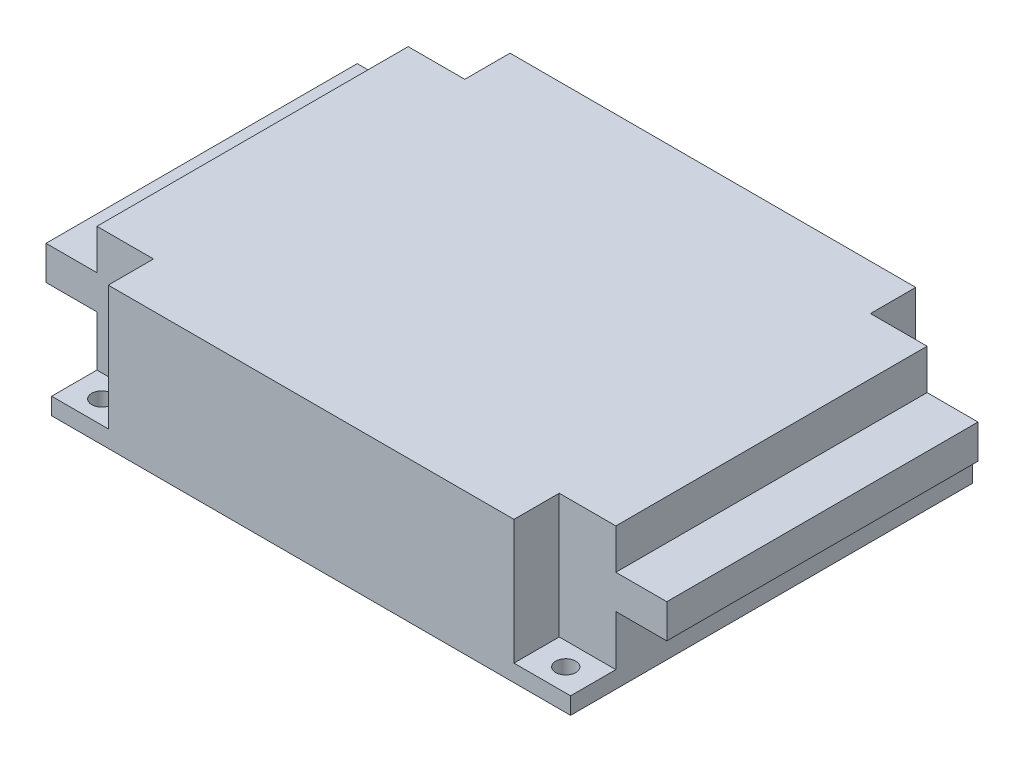
ISO-10303-21;
HEADER;
FILE_DESCRIPTION(('STEP AP214'),'2;1');
FILE_NAME('part.step','',(''),(''),'','','');
FILE_SCHEMA(('AUTOMOTIVE_DESIGN { 1 0 10303 214 1 1 1 1 }'));
ENDSEC;
DATA;
#1=APPLICATION_CONTEXT('core data for automotive mechanical design processes');
#2=APPLICATION_PROTOCOL_DEFINITION('international standard','automotive_design',2000,#1);
#3=PRODUCT_CONTEXT('',#1,'mechanical');
#4=PRODUCT('Part','Part','',(#3));
#5=PRODUCT_RELATED_PRODUCT_CATEGORY('part','',(#4));
#6=PRODUCT_DEFINITION_FORMATION('','',#4);
#7=PRODUCT_DEFINITION_CONTEXT('part definition',#1,'design');
#8=PRODUCT_DEFINITION('design','',#6,#7);
#9=PRODUCT_DEFINITION_SHAPE('','',#8);
#10=(LENGTH_UNIT() NAMED_UNIT(*) SI_UNIT(.MILLI.,.METRE.));
#11=(NAMED_UNIT(*) PLANE_ANGLE_UNIT() SI_UNIT($,.RADIAN.));
#12=(NAMED_UNIT(*) SI_UNIT($,.STERADIAN.) SOLID_ANGLE_UNIT());
#13=UNCERTAINTY_MEASURE_WITH_UNIT(LENGTH_MEASURE(1.E-05),#10,'distance_accuracy_value','');
#14=(GEOMETRIC_REPRESENTATION_CONTEXT(3) GLOBAL_UNCERTAINTY_ASSIGNED_CONTEXT((#13)) GLOBAL_UNIT_ASSIGNED_CONTEXT((#10,
#11,#12)) REPRESENTATION_CONTEXT('',''));
#15=CARTESIAN_POINT('',(0.,0.,0.));
#16=DIRECTION('',(0.,0.,1.));
#17=DIRECTION('',(1.,0.,0.));
#18=AXIS2_PLACEMENT_3D('',#15,#16,#17);
#19=CARTESIAN_POINT('',(91.7,3.,0.));
#20=DIRECTION('',(1.,0.,0.));
#21=DIRECTION('',(0.,0.,-1.));
#22=AXIS2_PLACEMENT_3D('',#19,#20,#21);
#23=PLANE('',#22);
#24=DIRECTION('',(0.,0.,-1.));
#25=VECTOR('',#24,1.);
#26=CARTESIAN_POINT('',(91.7,11.9,-51.9997296170942));
#27=LINE('',#26,#25);
#28=CARTESIAN_POINT('',(91.7,11.9,2.99972961709421));
#29=VERTEX_POINT('',#28);
#30=CARTESIAN_POINT('',(91.7,11.9,-51.9997296170942));
#31=VERTEX_POINT('',#30);
#32=EDGE_CURVE('E51',#29,#31,#27,.T.);
#33=ORIENTED_EDGE('',*,*,#32,.F.);
#34=DIRECTION('',(0.,-1.,0.));
#35=VECTOR('',#34,1.);
#36=CARTESIAN_POINT('',(91.7,25.,2.99972961709421));
#37=LINE('',#36,#35);
#38=CARTESIAN_POINT('',(91.7,3.,2.99972961709421));
#39=VERTEX_POINT('',#38);
#40=EDGE_CURVE('E337',#29,#39,#37,.T.);
#41=ORIENTED_EDGE('',*,*,#40,.T.);
#42=DIRECTION('',(0.,0.,-1.));
#43=VECTOR('',#42,1.);
#44=CARTESIAN_POINT('',(91.7,3.,0.));
#45=LINE('',#44,#43);
#46=CARTESIAN_POINT('',(91.7,3.,11.));
#47=VERTEX_POINT('',#46);
#48=EDGE_CURVE('E297',#47,#39,#45,.T.);
#49=ORIENTED_EDGE('',*,*,#48,.F.);
#50=DIRECTION('',(0.,-1.,0.));
#51=VECTOR('',#50,1.);
#52=CARTESIAN_POINT('',(91.7,3.,11.));
#53=LINE('',#52,#51);
#54=CARTESIAN_POINT('',(91.7,0.,11.));
#55=VERTEX_POINT('',#54);
#56=EDGE_CURVE('E300',#47,#55,#53,.T.);
#57=ORIENTED_EDGE('',*,*,#56,.T.);
#58=DIRECTION('',(0.,0.,1.));
#59=VECTOR('',#58,1.);
#60=CARTESIAN_POINT('',(91.7,0.,0.));
#61=LINE('',#60,#59);
#62=CARTESIAN_POINT('',(91.7,0.,-60.));
#63=VERTEX_POINT('',#62);
#64=EDGE_CURVE('E376',#63,#55,#61,.T.);
#65=ORIENTED_EDGE('',*,*,#64,.F.);
#66=DIRECTION('',(0.,-1.,0.));
#67=VECTOR('',#66,1.);
#68=CARTESIAN_POINT('',(91.7,3.,-60.));
#69=LINE('',#68,#67);
#70=CARTESIAN_POINT('',(91.7,3.,-60.));
#71=VERTEX_POINT('',#70);
#72=EDGE_CURVE('E11',#71,#63,#69,.T.);
#73=ORIENTED_EDGE('',*,*,#72,.F.);
#74=DIRECTION('',(0.,0.,1.));
#75=VECTOR('',#74,1.);
#76=CARTESIAN_POINT('',(91.7,3.,0.));
#77=LINE('',#76,#75);
#78=CARTESIAN_POINT('',(91.7,3.,-51.9997296170942));
#79=VERTEX_POINT('',#78);
#80=EDGE_CURVE('E382',#71,#79,#77,.T.);
#81=ORIENTED_EDGE('',*,*,#80,.T.);
#82=DIRECTION('',(0.,-1.,0.));
#83=VECTOR('',#82,1.);
#84=CARTESIAN_POINT('',(91.7,25.,-51.9997296170942));
#85=LINE('',#84,#83);
#86=EDGE_CURVE('E56',#31,#79,#85,.T.);
#87=ORIENTED_EDGE('',*,*,#86,.F.);
#88=EDGE_LOOP('',(#33,#41,#49,#57,#65,#73,#81,#87));
#89=FACE_BOUND('',#88,.T.);
#90=ADVANCED_FACE('F36',(#89),#23,.T.);
#91=CARTESIAN_POINT('',(0.,25.,0.));
#92=DIRECTION('',(1.,0.,0.));
#93=DIRECTION('',(0.,0.,-1.));
#94=AXIS2_PLACEMENT_3D('',#91,#92,#93);
#95=PLANE('',#94);
#96=DIRECTION('',(0.,-1.,0.));
#97=VECTOR('',#96,1.);
#98=CARTESIAN_POINT('',(0.,25.,2.99972961709421));
#99=LINE('',#98,#97);
#100=CARTESIAN_POINT('',(0.,11.9,2.99972961709421));
#101=VERTEX_POINT('',#100);
#102=CARTESIAN_POINT('',(0.,3.,2.99972961709421));
#103=VERTEX_POINT('',#102);
#104=EDGE_CURVE('E354',#101,#103,#99,.T.);
#105=ORIENTED_EDGE('',*,*,#104,.F.);
#106=DIRECTION('',(0.,0.,-1.));
#107=VECTOR('',#106,1.);
#108=CARTESIAN_POINT('',(0.,11.9,2.99972961709421));
#109=LINE('',#108,#107);
#110=CARTESIAN_POINT('',(0.,11.9,-51.9997296170942));
#111=VERTEX_POINT('',#110);
#112=EDGE_CURVE('E217',#101,#111,#109,.T.);
#113=ORIENTED_EDGE('',*,*,#112,.T.);
#114=DIRECTION('',(0.,-1.,0.));
#115=VECTOR('',#114,1.);
#116=CARTESIAN_POINT('',(0.,25.,-51.9997296170942));
#117=LINE('',#116,#115);
#118=CARTESIAN_POINT('',(0.,3.,-51.9997296170942));
#119=VERTEX_POINT('',#118);
#120=EDGE_CURVE('E358',#111,#119,#117,.T.);
#121=ORIENTED_EDGE('',*,*,#120,.T.);
#122=DIRECTION('',(0.,0.,1.));
#123=VECTOR('',#122,1.);
#124=CARTESIAN_POINT('',(0.,3.,0.));
#125=LINE('',#124,#123);
#126=CARTESIAN_POINT('',(0.,3.,-60.));
#127=VERTEX_POINT('',#126);
#128=EDGE_CURVE('E255',#127,#119,#125,.T.);
#129=ORIENTED_EDGE('',*,*,#128,.F.);
#130=DIRECTION('',(0.,-1.,0.));
#131=VECTOR('',#130,1.);
#132=CARTESIAN_POINT('',(0.,3.,-60.));
#133=LINE('',#132,#131);
#134=CARTESIAN_POINT('',(0.,0.,-60.));
#135=VERTEX_POINT('',#134);
#136=EDGE_CURVE('E262',#127,#135,#133,.T.);
#137=ORIENTED_EDGE('',*,*,#136,.T.);
#138=DIRECTION('',(0.,0.,1.));
#139=VECTOR('',#138,1.);
#140=CARTESIAN_POINT('',(0.,0.,0.));
#141=LINE('',#140,#139);
#142=CARTESIAN_POINT('',(0.,0.,11.));
#143=VERTEX_POINT('',#142);
#144=EDGE_CURVE('E305',#135,#143,#141,.T.);
#145=ORIENTED_EDGE('',*,*,#144,.T.);
#146=DIRECTION('',(0.,-1.,0.));
#147=VECTOR('',#146,1.);
#148=CARTESIAN_POINT('',(0.,3.,11.));
#149=LINE('',#148,#147);
#150=CARTESIAN_POINT('',(0.,3.,11.));
#151=VERTEX_POINT('',#150);
#152=EDGE_CURVE('E282',#151,#143,#149,.T.);
#153=ORIENTED_EDGE('',*,*,#152,.F.);
#154=DIRECTION('',(0.,0.,-1.));
#155=VECTOR('',#154,1.);
#156=CARTESIAN_POINT('',(0.,3.,0.));
#157=LINE('',#156,#155);
#158=EDGE_CURVE('E271',#151,#103,#157,.T.);
#159=ORIENTED_EDGE('',*,*,#158,.T.);
#160=EDGE_LOOP('',(#105,#113,#121,#129,#137,#145,#153,#159));
#161=FACE_BOUND('',#160,.T.);
#162=ADVANCED_FACE('F427',(#161),#95,.F.);
#163=DIRECTION('',(0.,0.,1.));
#164=VECTOR('',#163,1.);
#165=CARTESIAN_POINT('',(91.7,17.9,2.99972961709421));
#166=LINE('',#165,#164);
#167=CARTESIAN_POINT('',(91.7,17.9,-51.9997296170942));
#168=VERTEX_POINT('',#167);
#169=CARTESIAN_POINT('',(91.7,17.9,2.99972961709421));
#170=VERTEX_POINT('',#169);
#171=EDGE_CURVE('E214',#168,#170,#166,.T.);
#172=ORIENTED_EDGE('',*,*,#171,.F.);
#173=CARTESIAN_POINT('',(91.7,25.,-51.9997296170942));
#174=VERTEX_POINT('',#173);
#175=EDGE_CURVE('E374',#174,#168,#85,.T.);
#176=ORIENTED_EDGE('',*,*,#175,.F.);
#177=DIRECTION('',(0.,0.,1.));
#178=VECTOR('',#177,1.);
#179=CARTESIAN_POINT('',(91.7,25.,0.));
#180=LINE('',#179,#178);
#181=CARTESIAN_POINT('',(91.7,25.,2.99972961709421));
#182=VERTEX_POINT('',#181);
#183=EDGE_CURVE('E306',#174,#182,#180,.T.);
#184=ORIENTED_EDGE('',*,*,#183,.T.);
#185=EDGE_CURVE('E340',#182,#170,#37,.T.);
#186=ORIENTED_EDGE('',*,*,#185,.T.);
#187=EDGE_LOOP('',(#172,#176,#184,#186));
#188=FACE_BOUND('',#187,.T.);
#189=ADVANCED_FACE('F38',(#188),#23,.T.);
#190=CARTESIAN_POINT('',(0.,3.,-60.));
#191=DIRECTION('',(0.,0.,-1.));
#192=DIRECTION('',(-1.,0.,0.));
#193=AXIS2_PLACEMENT_3D('',#190,#191,#192);
#194=PLANE('',#193);
#195=DIRECTION('',(1.,0.,0.));
#196=VECTOR('',#195,1.);
#197=CARTESIAN_POINT('',(0.,0.,-60.));
#198=LINE('',#197,#196);
#199=EDGE_CURVE('E391',#135,#63,#198,.T.);
#200=ORIENTED_EDGE('',*,*,#199,.F.);
#201=ORIENTED_EDGE('',*,*,#136,.F.);
#202=DIRECTION('',(1.,0.,0.));
#203=VECTOR('',#202,1.);
#204=CARTESIAN_POINT('',(0.,3.,-60.));
#205=LINE('',#204,#203);
#206=CARTESIAN_POINT('',(10.0029233499299,3.,-60.));
#207=VERTEX_POINT('',#206);
#208=EDGE_CURVE('E252',#127,#207,#205,.T.);
#209=ORIENTED_EDGE('',*,*,#208,.T.);
#210=DIRECTION('',(0.,-1.,0.));
#211=VECTOR('',#210,1.);
#212=CARTESIAN_POINT('',(10.0029233499299,25.,-60.));
#213=LINE('',#212,#211);
#214=CARTESIAN_POINT('',(10.0029233499299,25.,-60.));
#215=VERTEX_POINT('',#214);
#216=EDGE_CURVE('E365',#215,#207,#213,.T.);
#217=ORIENTED_EDGE('',*,*,#216,.F.);
#218=DIRECTION('',(1.,0.,0.));
#219=VECTOR('',#218,1.);
#220=CARTESIAN_POINT('',(0.,25.,-60.));
#221=LINE('',#220,#219);
#222=CARTESIAN_POINT('',(81.6970766500701,25.,-60.));
#223=VERTEX_POINT('',#222);
#224=EDGE_CURVE('E314',#215,#223,#221,.T.);
#225=ORIENTED_EDGE('',*,*,#224,.T.);
#226=DIRECTION('',(0.,-1.,0.));
#227=VECTOR('',#226,1.);
#228=CARTESIAN_POINT('',(81.6970766500701,25.,-60.));
#229=LINE('',#228,#227);
#230=CARTESIAN_POINT('',(81.6970766500701,3.,-60.));
#231=VERTEX_POINT('',#230);
#232=EDGE_CURVE('E368',#223,#231,#229,.T.);
#233=ORIENTED_EDGE('',*,*,#232,.T.);
#234=DIRECTION('',(1.,0.,0.));
#235=VECTOR('',#234,1.);
#236=CARTESIAN_POINT('',(0.,3.,-60.));
#237=LINE('',#236,#235);
#238=EDGE_CURVE('E384',#231,#71,#237,.T.);
#239=ORIENTED_EDGE('',*,*,#238,.T.);
#240=ORIENTED_EDGE('',*,*,#72,.T.);
#241=EDGE_LOOP('',(#200,#201,#209,#217,#225,#233,#239,#240));
#242=FACE_BOUND('',#241,.T.);
#243=ADVANCED_FACE('F435',(#242),#194,.T.);
#244=CARTESIAN_POINT('',(86.8463240658172,3.,-55.9996014014068));
#245=DIRECTION('',(0.,-1.,0.));
#246=DIRECTION('',(0.,0.,-1.));
#247=AXIS2_PLACEMENT_3D('',#244,#245,#246);
#248=CYLINDRICAL_SURFACE('',#247,1.76559838278759);
#249=CARTESIAN_POINT('',(86.8463240658172,3.,-55.9996014014068));
#250=DIRECTION('',(0.,1.,0.));
#251=DIRECTION('',(0.,0.,1.));
#252=AXIS2_PLACEMENT_3D('',#249,#250,#251);
#253=CIRCLE('',#252,1.76559838278759);
#254=CARTESIAN_POINT('',(86.8463240658172,3.,-54.2340030186192));
#255=VERTEX_POINT('',#254);
#256=EDGE_CURVE('E44',#255,#255,#253,.F.);
#257=ORIENTED_EDGE('',*,*,#256,.F.);
#258=EDGE_LOOP('',(#257));
#259=FACE_BOUND('',#258,.T.);
#260=CARTESIAN_POINT('',(86.8463240658172,0.,-55.9996014014068));
#261=DIRECTION('',(0.,1.,0.));
#262=DIRECTION('',(0.,0.,1.));
#263=AXIS2_PLACEMENT_3D('',#260,#261,#262);
#264=CIRCLE('',#263,1.76559838278759);
#265=CARTESIAN_POINT('',(86.8463240658172,0.,-54.2340030186192));
#266=VERTEX_POINT('',#265);
#267=EDGE_CURVE('E380',#266,#266,#264,.F.);
#268=ORIENTED_EDGE('',*,*,#267,.T.);
#269=EDGE_LOOP('',(#268));
#270=FACE_BOUND('',#269,.T.);
#271=ADVANCED_FACE('F396',(#259,#270),#248,.F.);
#272=CARTESIAN_POINT('',(0.,3.,0.));
#273=DIRECTION('',(0.,1.,0.));
#274=DIRECTION('',(0.,0.,1.));
#275=AXIS2_PLACEMENT_3D('',#272,#273,#274);
#276=PLANE('',#275);
#277=DIRECTION('',(0.,0.,-1.));
#278=VECTOR('',#277,1.);
#279=CARTESIAN_POINT('',(81.6970766500701,3.,0.));
#280=LINE('',#279,#278);
#281=CARTESIAN_POINT('',(81.6970766500701,3.,-51.9997296170942));
#282=VERTEX_POINT('',#281);
#283=EDGE_CURVE('E377',#282,#231,#280,.T.);
#284=ORIENTED_EDGE('',*,*,#283,.F.);
#285=DIRECTION('',(-1.,0.,0.));
#286=VECTOR('',#285,1.);
#287=CARTESIAN_POINT('',(0.,3.,-51.9997296170942));
#288=LINE('',#287,#286);
#289=EDGE_CURVE('E379',#79,#282,#288,.T.);
#290=ORIENTED_EDGE('',*,*,#289,.F.);
#291=ORIENTED_EDGE('',*,*,#80,.F.);
#292=ORIENTED_EDGE('',*,*,#238,.F.);
#293=EDGE_LOOP('',(#284,#290,#291,#292));
#294=FACE_BOUND('',#293,.T.);
#295=ORIENTED_EDGE('',*,*,#256,.T.);
#296=EDGE_LOOP('',(#295));
#297=FACE_BOUND('',#296,.T.);
#298=ADVANCED_FACE('F401',(#294,#297),#276,.T.);
#299=CARTESIAN_POINT('',(0.,0.,0.));
#300=DIRECTION('',(0.,1.,0.));
#301=DIRECTION('',(0.,0.,1.));
#302=AXIS2_PLACEMENT_3D('',#299,#300,#301);
#303=PLANE('',#302);
#304=ORIENTED_EDGE('',*,*,#144,.F.);
#305=ORIENTED_EDGE('',*,*,#199,.T.);
#306=ORIENTED_EDGE('',*,*,#64,.T.);
#307=DIRECTION('',(1.,0.,0.));
#308=VECTOR('',#307,1.);
#309=CARTESIAN_POINT('',(0.,0.,11.));
#310=LINE('',#309,#308);
#311=EDGE_CURVE('E310',#143,#55,#310,.T.);
#312=ORIENTED_EDGE('',*,*,#311,.F.);
#313=EDGE_LOOP('',(#304,#305,#306,#312));
#314=FACE_BOUND('',#313,.T.);
#315=ORIENTED_EDGE('',*,*,#267,.F.);
#316=EDGE_LOOP('',(#315));
#317=FACE_BOUND('',#316,.T.);
#318=CARTESIAN_POINT('',(86.8463240658172,0.,6.99960140140685));
#319=DIRECTION('',(0.,1.,0.));
#320=DIRECTION('',(0.,0.,1.));
#321=AXIS2_PLACEMENT_3D('',#318,#319,#320);
#322=CIRCLE('',#321,1.76559838278758);
#323=CARTESIAN_POINT('',(86.8463240658172,0.,8.76519978419443));
#324=VERTEX_POINT('',#323);
#325=EDGE_CURVE('E287',#324,#324,#322,.T.);
#326=ORIENTED_EDGE('',*,*,#325,.T.);
#327=EDGE_LOOP('',(#326));
#328=FACE_BOUND('',#327,.T.);
#329=CARTESIAN_POINT('',(4.85367593418285,0.,6.99960140140685));
#330=DIRECTION('',(0.,1.,0.));
#331=DIRECTION('',(0.,0.,1.));
#332=AXIS2_PLACEMENT_3D('',#329,#330,#331);
#333=CIRCLE('',#332,1.76559838278757);
#334=CARTESIAN_POINT('',(4.85367593418285,0.,8.76519978419442));
#335=VERTEX_POINT('',#334);
#336=EDGE_CURVE('E267',#335,#335,#333,.F.);
#337=ORIENTED_EDGE('',*,*,#336,.F.);
#338=EDGE_LOOP('',(#337));
#339=FACE_BOUND('',#338,.T.);
#340=CARTESIAN_POINT('',(4.85367593418285,0.,-55.9996014014068));
#341=DIRECTION('',(0.,1.,0.));
#342=DIRECTION('',(0.,0.,1.));
#343=AXIS2_PLACEMENT_3D('',#340,#341,#342);
#344=CIRCLE('',#343,1.76559838278758);
#345=CARTESIAN_POINT('',(4.85367593418285,0.,-54.2340030186193));
#346=VERTEX_POINT('',#345);
#347=EDGE_CURVE('E243',#346,#346,#344,.T.);
#348=ORIENTED_EDGE('',*,*,#347,.T.);
#349=EDGE_LOOP('',(#348));
#350=FACE_BOUND('',#349,.T.);
#351=ADVANCED_FACE('F398',(#314,#317,#328,#339,#350),#303,.F.);
#352=CARTESIAN_POINT('',(0.,25.,-51.9997296170942));
#353=DIRECTION('',(0.,0.,1.));
#354=DIRECTION('',(1.,0.,0.));
#355=AXIS2_PLACEMENT_3D('',#352,#353,#354);
#356=PLANE('',#355);
#357=ORIENTED_EDGE('',*,*,#289,.T.);
#358=DIRECTION('',(0.,-1.,0.));
#359=VECTOR('',#358,1.);
#360=CARTESIAN_POINT('',(81.6970766500701,25.,-51.9997296170942));
#361=LINE('',#360,#359);
#362=CARTESIAN_POINT('',(81.6970766500701,25.,-51.9997296170942));
#363=VERTEX_POINT('',#362);
#364=EDGE_CURVE('E371',#363,#282,#361,.T.);
#365=ORIENTED_EDGE('',*,*,#364,.F.);
#366=DIRECTION('',(-1.,0.,0.));
#367=VECTOR('',#366,1.);
#368=CARTESIAN_POINT('',(0.,25.,-51.9997296170942));
#369=LINE('',#368,#367);
#370=EDGE_CURVE('E309',#174,#363,#369,.T.);
#371=ORIENTED_EDGE('',*,*,#370,.F.);
#372=ORIENTED_EDGE('',*,*,#175,.T.);
#373=DIRECTION('',(-1.,0.,0.));
#374=VECTOR('',#373,1.);
#375=CARTESIAN_POINT('',(100.7,17.9,-51.9997296170942));
#376=LINE('',#375,#374);
#377=CARTESIAN_POINT('',(100.7,17.9,-51.9997296170942));
#378=VERTEX_POINT('',#377);
#379=EDGE_CURVE('E201',#378,#168,#376,.T.);
#380=ORIENTED_EDGE('',*,*,#379,.F.);
#381=DIRECTION('',(0.,1.,0.));
#382=VECTOR('',#381,1.);
#383=CARTESIAN_POINT('',(100.7,17.9,-51.9997296170942));
#384=LINE('',#383,#382);
#385=CARTESIAN_POINT('',(100.7,11.9,-51.9997296170942));
#386=VERTEX_POINT('',#385);
#387=EDGE_CURVE('E194',#386,#378,#384,.T.);
#388=ORIENTED_EDGE('',*,*,#387,.F.);
#389=DIRECTION('',(-1.,0.,0.));
#390=VECTOR('',#389,1.);
#391=CARTESIAN_POINT('',(100.7,11.9,-51.9997296170942));
#392=LINE('',#391,#390);
#393=EDGE_CURVE('E198',#386,#31,#392,.T.);
#394=ORIENTED_EDGE('',*,*,#393,.T.);
#395=ORIENTED_EDGE('',*,*,#86,.T.);
#396=EDGE_LOOP('',(#357,#365,#371,#372,#380,#388,#394,#395));
#397=FACE_BOUND('',#396,.T.);
#398=ADVANCED_FACE('F196',(#397),#356,.F.);
#399=CARTESIAN_POINT('',(81.6970766500701,25.,0.));
#400=DIRECTION('',(-1.,0.,0.));
#401=DIRECTION('',(0.,0.,1.));
#402=AXIS2_PLACEMENT_3D('',#399,#400,#401);
#403=PLANE('',#402);
#404=ORIENTED_EDGE('',*,*,#283,.T.);
#405=ORIENTED_EDGE('',*,*,#232,.F.);
#406=DIRECTION('',(0.,0.,-1.));
#407=VECTOR('',#406,1.);
#408=CARTESIAN_POINT('',(81.6970766500701,25.,0.));
#409=LINE('',#408,#407);
#410=EDGE_CURVE('E312',#363,#223,#409,.T.);
#411=ORIENTED_EDGE('',*,*,#410,.F.);
#412=ORIENTED_EDGE('',*,*,#364,.T.);
#413=EDGE_LOOP('',(#404,#405,#411,#412));
#414=FACE_BOUND('',#413,.T.);
#415=ADVANCED_FACE('F480',(#414),#403,.F.);
#416=CARTESIAN_POINT('',(10.0029233499299,25.,0.));
#417=DIRECTION('',(-1.,0.,0.));
#418=DIRECTION('',(0.,0.,1.));
#419=AXIS2_PLACEMENT_3D('',#416,#417,#418);
#420=PLANE('',#419);
#421=DIRECTION('',(0.,0.,-1.));
#422=VECTOR('',#421,1.);
#423=CARTESIAN_POINT('',(10.0029233499299,3.,0.));
#424=LINE('',#423,#422);
#425=CARTESIAN_POINT('',(10.0029233499299,3.,-51.9997296170942));
#426=VERTEX_POINT('',#425);
#427=EDGE_CURVE('E260',#426,#207,#424,.T.);
#428=ORIENTED_EDGE('',*,*,#427,.F.);
#429=DIRECTION('',(0.,-1.,0.));
#430=VECTOR('',#429,1.);
#431=CARTESIAN_POINT('',(10.0029233499299,25.,-51.9997296170942));
#432=LINE('',#431,#430);
#433=CARTESIAN_POINT('',(10.0029233499299,25.,-51.9997296170942));
#434=VERTEX_POINT('',#433);
#435=EDGE_CURVE('E362',#434,#426,#432,.T.);
#436=ORIENTED_EDGE('',*,*,#435,.F.);
#437=DIRECTION('',(0.,0.,-1.));
#438=VECTOR('',#437,1.);
#439=CARTESIAN_POINT('',(10.0029233499299,25.,0.));
#440=LINE('',#439,#438);
#441=EDGE_CURVE('E317',#434,#215,#440,.T.);
#442=ORIENTED_EDGE('',*,*,#441,.T.);
#443=ORIENTED_EDGE('',*,*,#216,.T.);
#444=EDGE_LOOP('',(#428,#436,#442,#443));
#445=FACE_BOUND('',#444,.T.);
#446=ADVANCED_FACE('F510',(#445),#420,.T.);
#447=CARTESIAN_POINT('',(0.,25.,-51.9997296170942));
#448=DIRECTION('',(0.,0.,-1.));
#449=DIRECTION('',(-1.,0.,0.));
#450=AXIS2_PLACEMENT_3D('',#447,#448,#449);
#451=PLANE('',#450);
#452=DIRECTION('',(1.,0.,0.));
#453=VECTOR('',#452,1.);
#454=CARTESIAN_POINT('',(0.,3.,-51.9997296170942));
#455=LINE('',#454,#453);
#456=EDGE_CURVE('E258',#119,#426,#455,.T.);
#457=ORIENTED_EDGE('',*,*,#456,.F.);
#458=ORIENTED_EDGE('',*,*,#120,.F.);
#459=DIRECTION('',(1.,0.,0.));
#460=VECTOR('',#459,1.);
#461=CARTESIAN_POINT('',(-9.,11.9,-51.9997296170942));
#462=LINE('',#461,#460);
#463=CARTESIAN_POINT('',(-9.,11.9,-51.9997296170942));
#464=VERTEX_POINT('',#463);
#465=EDGE_CURVE('E246',#464,#111,#462,.T.);
#466=ORIENTED_EDGE('',*,*,#465,.F.);
#467=DIRECTION('',(0.,1.,0.));
#468=VECTOR('',#467,1.);
#469=CARTESIAN_POINT('',(-9.,17.9,-51.9997296170942));
#470=LINE('',#469,#468);
#471=CARTESIAN_POINT('',(-9.,17.9,-51.9997296170942));
#472=VERTEX_POINT('',#471);
#473=EDGE_CURVE('E232',#464,#472,#470,.T.);
#474=ORIENTED_EDGE('',*,*,#473,.T.);
#475=DIRECTION('',(1.,0.,0.));
#476=VECTOR('',#475,1.);
#477=CARTESIAN_POINT('',(-9.,17.9,-51.9997296170942));
#478=LINE('',#477,#476);
#479=CARTESIAN_POINT('',(0.,17.9,-51.9997296170942));
#480=VERTEX_POINT('',#479);
#481=EDGE_CURVE('E244',#472,#480,#478,.T.);
#482=ORIENTED_EDGE('',*,*,#481,.T.);
#483=CARTESIAN_POINT('',(0.,25.,-51.9997296170942));
#484=VERTEX_POINT('',#483);
#485=EDGE_CURVE('E359',#484,#480,#117,.T.);
#486=ORIENTED_EDGE('',*,*,#485,.F.);
#487=DIRECTION('',(1.,0.,0.));
#488=VECTOR('',#487,1.);
#489=CARTESIAN_POINT('',(0.,25.,-51.9997296170942));
#490=LINE('',#489,#488);
#491=EDGE_CURVE('E320',#484,#434,#490,.T.);
#492=ORIENTED_EDGE('',*,*,#491,.T.);
#493=ORIENTED_EDGE('',*,*,#435,.T.);
#494=EDGE_LOOP('',(#457,#458,#466,#474,#482,#486,#492,#493));
#495=FACE_BOUND('',#494,.T.);
#496=ADVANCED_FACE('F513',(#495),#451,.T.);
#497=ORIENTED_EDGE('',*,*,#485,.T.);
#498=DIRECTION('',(0.,0.,1.));
#499=VECTOR('',#498,1.);
#500=CARTESIAN_POINT('',(0.,17.9,2.99972961709421));
#501=LINE('',#500,#499);
#502=CARTESIAN_POINT('',(0.,17.9,2.99972961709421));
#503=VERTEX_POINT('',#502);
#504=EDGE_CURVE('E220',#480,#503,#501,.T.);
#505=ORIENTED_EDGE('',*,*,#504,.T.);
#506=CARTESIAN_POINT('',(0.,25.,2.99972961709421));
#507=VERTEX_POINT('',#506);
#508=EDGE_CURVE('E355',#507,#503,#99,.T.);
#509=ORIENTED_EDGE('',*,*,#508,.F.);
#510=DIRECTION('',(0.,0.,1.));
#511=VECTOR('',#510,1.);
#512=CARTESIAN_POINT('',(0.,25.,0.));
#513=LINE('',#512,#511);
#514=EDGE_CURVE('E323',#484,#507,#513,.T.);
#515=ORIENTED_EDGE('',*,*,#514,.F.);
#516=EDGE_LOOP('',(#497,#505,#509,#515));
#517=FACE_BOUND('',#516,.T.);
#518=ADVANCED_FACE('F433',(#517),#95,.F.);
#519=CARTESIAN_POINT('',(0.,25.,2.99972961709421));
#520=DIRECTION('',(0.,0.,-1.));
#521=DIRECTION('',(-1.,0.,0.));
#522=AXIS2_PLACEMENT_3D('',#519,#520,#521);
#523=PLANE('',#522);
#524=ORIENTED_EDGE('',*,*,#508,.T.);
#525=DIRECTION('',(1.,0.,0.));
#526=VECTOR('',#525,1.);
#527=CARTESIAN_POINT('',(-9.,17.9,2.99972961709421));
#528=LINE('',#527,#526);
#529=CARTESIAN_POINT('',(-9.,17.9,2.99972961709421));
#530=VERTEX_POINT('',#529);
#531=EDGE_CURVE('E241',#530,#503,#528,.T.);
#532=ORIENTED_EDGE('',*,*,#531,.F.);
#533=DIRECTION('',(0.,-1.,0.));
#534=VECTOR('',#533,1.);
#535=CARTESIAN_POINT('',(-9.,11.9,2.99972961709421));
#536=LINE('',#535,#534);
#537=CARTESIAN_POINT('',(-9.,11.9,2.99972961709421));
#538=VERTEX_POINT('',#537);
#539=EDGE_CURVE('E226',#530,#538,#536,.T.);
#540=ORIENTED_EDGE('',*,*,#539,.T.);
#541=DIRECTION('',(1.,0.,0.));
#542=VECTOR('',#541,1.);
#543=CARTESIAN_POINT('',(-9.,11.9,2.99972961709421));
#544=LINE('',#543,#542);
#545=EDGE_CURVE('E237',#538,#101,#544,.T.);
#546=ORIENTED_EDGE('',*,*,#545,.T.);
#547=ORIENTED_EDGE('',*,*,#104,.T.);
#548=DIRECTION('',(1.,0.,0.));
#549=VECTOR('',#548,1.);
#550=CARTESIAN_POINT('',(0.,3.,2.99972961709421));
#551=LINE('',#550,#549);
#552=CARTESIAN_POINT('',(10.0029233499299,3.,2.99972961709421));
#553=VERTEX_POINT('',#552);
#554=EDGE_CURVE('E268',#103,#553,#551,.T.);
#555=ORIENTED_EDGE('',*,*,#554,.T.);
#556=DIRECTION('',(0.,-1.,0.));
#557=VECTOR('',#556,1.);
#558=CARTESIAN_POINT('',(10.0029233499299,25.,2.99972961709421));
#559=LINE('',#558,#557);
#560=CARTESIAN_POINT('',(10.0029233499299,25.,2.99972961709421));
#561=VERTEX_POINT('',#560);
#562=EDGE_CURVE('E351',#561,#553,#559,.T.);
#563=ORIENTED_EDGE('',*,*,#562,.F.);
#564=DIRECTION('',(1.,0.,0.));
#565=VECTOR('',#564,1.);
#566=CARTESIAN_POINT('',(0.,25.,2.99972961709421));
#567=LINE('',#566,#565);
#568=EDGE_CURVE('E325',#507,#561,#567,.T.);
#569=ORIENTED_EDGE('',*,*,#568,.F.);
#570=EDGE_LOOP('',(#524,#532,#540,#546,#547,#555,#563,#569));
#571=FACE_BOUND('',#570,.T.);
#572=ADVANCED_FACE('F501',(#571),#523,.F.);
#573=CARTESIAN_POINT('',(10.0029233499299,25.,0.));
#574=DIRECTION('',(1.,0.,0.));
#575=DIRECTION('',(0.,0.,-1.));
#576=AXIS2_PLACEMENT_3D('',#573,#574,#575);
#577=PLANE('',#576);
#578=ORIENTED_EDGE('',*,*,#562,.T.);
#579=DIRECTION('',(0.,0.,1.));
#580=VECTOR('',#579,1.);
#581=CARTESIAN_POINT('',(10.0029233499299,3.,0.));
#582=LINE('',#581,#580);
#583=CARTESIAN_POINT('',(10.0029233499299,3.,11.));
#584=VERTEX_POINT('',#583);
#585=EDGE_CURVE('E276',#553,#584,#582,.T.);
#586=ORIENTED_EDGE('',*,*,#585,.T.);
#587=DIRECTION('',(0.,-1.,0.));
#588=VECTOR('',#587,1.);
#589=CARTESIAN_POINT('',(10.0029233499299,25.,11.));
#590=LINE('',#589,#588);
#591=CARTESIAN_POINT('',(10.0029233499299,25.,11.));
#592=VERTEX_POINT('',#591);
#593=EDGE_CURVE('E348',#592,#584,#590,.T.);
#594=ORIENTED_EDGE('',*,*,#593,.F.);
#595=DIRECTION('',(0.,0.,1.));
#596=VECTOR('',#595,1.);
#597=CARTESIAN_POINT('',(10.0029233499299,25.,0.));
#598=LINE('',#597,#596);
#599=EDGE_CURVE('E327',#561,#592,#598,.T.);
#600=ORIENTED_EDGE('',*,*,#599,.F.);
#601=EDGE_LOOP('',(#578,#586,#594,#600));
#602=FACE_BOUND('',#601,.T.);
#603=ADVANCED_FACE('F496',(#602),#577,.F.);
#604=CARTESIAN_POINT('',(0.,25.,11.));
#605=DIRECTION('',(0.,0.,-1.));
#606=DIRECTION('',(-1.,0.,0.));
#607=AXIS2_PLACEMENT_3D('',#604,#605,#606);
#608=PLANE('',#607);
#609=ORIENTED_EDGE('',*,*,#311,.T.);
#610=ORIENTED_EDGE('',*,*,#56,.F.);
#611=DIRECTION('',(1.,0.,0.));
#612=VECTOR('',#611,1.);
#613=CARTESIAN_POINT('',(0.,3.,11.));
#614=LINE('',#613,#612);
#615=CARTESIAN_POINT('',(81.6970766500701,3.,11.));
#616=VERTEX_POINT('',#615);
#617=EDGE_CURVE('E295',#616,#47,#614,.T.);
#618=ORIENTED_EDGE('',*,*,#617,.F.);
#619=DIRECTION('',(0.,-1.,0.));
#620=VECTOR('',#619,1.);
#621=CARTESIAN_POINT('',(81.6970766500701,25.,11.));
#622=LINE('',#621,#620);
#623=CARTESIAN_POINT('',(81.6970766500701,25.,11.));
#624=VERTEX_POINT('',#623);
#625=EDGE_CURVE('E345',#624,#616,#622,.T.);
#626=ORIENTED_EDGE('',*,*,#625,.F.);
#627=DIRECTION('',(1.,0.,0.));
#628=VECTOR('',#627,1.);
#629=CARTESIAN_POINT('',(0.,25.,11.));
#630=LINE('',#629,#628);
#631=EDGE_CURVE('E329',#592,#624,#630,.T.);
#632=ORIENTED_EDGE('',*,*,#631,.F.);
#633=ORIENTED_EDGE('',*,*,#593,.T.);
#634=DIRECTION('',(1.,0.,0.));
#635=VECTOR('',#634,1.);
#636=CARTESIAN_POINT('',(0.,3.,11.));
#637=LINE('',#636,#635);
#638=EDGE_CURVE('E274',#151,#584,#637,.T.);
#639=ORIENTED_EDGE('',*,*,#638,.F.);
#640=ORIENTED_EDGE('',*,*,#152,.T.);
#641=EDGE_LOOP('',(#609,#610,#618,#626,#632,#633,#639,#640));
#642=FACE_BOUND('',#641,.T.);
#643=ADVANCED_FACE('F466',(#642),#608,.F.);
#644=CARTESIAN_POINT('',(81.6970766500701,25.,0.));
#645=DIRECTION('',(1.,0.,0.));
#646=DIRECTION('',(0.,0.,-1.));
#647=AXIS2_PLACEMENT_3D('',#644,#645,#646);
#648=PLANE('',#647);
#649=DIRECTION('',(0.,0.,1.));
#650=VECTOR('',#649,1.);
#651=CARTESIAN_POINT('',(81.6970766500701,3.,0.));
#652=LINE('',#651,#650);
#653=CARTESIAN_POINT('',(81.6970766500701,3.,2.99972961709421));
#654=VERTEX_POINT('',#653);
#655=EDGE_CURVE('E293',#654,#616,#652,.T.);
#656=ORIENTED_EDGE('',*,*,#655,.F.);
#657=DIRECTION('',(0.,-1.,0.));
#658=VECTOR('',#657,1.);
#659=CARTESIAN_POINT('',(81.6970766500701,25.,2.99972961709421));
#660=LINE('',#659,#658);
#661=CARTESIAN_POINT('',(81.6970766500701,25.,2.99972961709421));
#662=VERTEX_POINT('',#661);
#663=EDGE_CURVE('E342',#662,#654,#660,.T.);
#664=ORIENTED_EDGE('',*,*,#663,.F.);
#665=DIRECTION('',(0.,0.,1.));
#666=VECTOR('',#665,1.);
#667=CARTESIAN_POINT('',(81.6970766500701,25.,0.));
#668=LINE('',#667,#666);
#669=EDGE_CURVE('E331',#662,#624,#668,.T.);
#670=ORIENTED_EDGE('',*,*,#669,.T.);
#671=ORIENTED_EDGE('',*,*,#625,.T.);
#672=EDGE_LOOP('',(#656,#664,#670,#671));
#673=FACE_BOUND('',#672,.T.);
#674=ADVANCED_FACE('F488',(#673),#648,.T.);
#675=CARTESIAN_POINT('',(0.,25.,2.99972961709421));
#676=DIRECTION('',(0.,0.,1.));
#677=DIRECTION('',(1.,0.,0.));
#678=AXIS2_PLACEMENT_3D('',#675,#676,#677);
#679=PLANE('',#678);
#680=DIRECTION('',(-1.,0.,0.));
#681=VECTOR('',#680,1.);
#682=CARTESIAN_POINT('',(0.,3.,2.99972961709421));
#683=LINE('',#682,#681);
#684=EDGE_CURVE('E291',#39,#654,#683,.T.);
#685=ORIENTED_EDGE('',*,*,#684,.F.);
#686=ORIENTED_EDGE('',*,*,#40,.F.);
#687=DIRECTION('',(-1.,0.,0.));
#688=VECTOR('',#687,1.);
#689=CARTESIAN_POINT('',(100.7,11.9,2.99972961709421));
#690=LINE('',#689,#688);
#691=CARTESIAN_POINT('',(100.7,11.9,2.99972961709421));
#692=VERTEX_POINT('',#691);
#693=EDGE_CURVE('E451',#692,#29,#690,.T.);
#694=ORIENTED_EDGE('',*,*,#693,.F.);
#695=DIRECTION('',(0.,-1.,0.));
#696=VECTOR('',#695,1.);
#697=CARTESIAN_POINT('',(100.7,11.9,2.99972961709421));
#698=LINE('',#697,#696);
#699=CARTESIAN_POINT('',(100.7,17.9,2.99972961709421));
#700=VERTEX_POINT('',#699);
#701=EDGE_CURVE('E210',#700,#692,#698,.T.);
#702=ORIENTED_EDGE('',*,*,#701,.F.);
#703=DIRECTION('',(-1.,0.,0.));
#704=VECTOR('',#703,1.);
#705=CARTESIAN_POINT('',(100.7,17.9,2.99972961709421));
#706=LINE('',#705,#704);
#707=EDGE_CURVE('E222',#700,#170,#706,.T.);
#708=ORIENTED_EDGE('',*,*,#707,.T.);
#709=ORIENTED_EDGE('',*,*,#185,.F.);
#710=DIRECTION('',(-1.,0.,0.));
#711=VECTOR('',#710,1.);
#712=CARTESIAN_POINT('',(0.,25.,2.99972961709421));
#713=LINE('',#712,#711);
#714=EDGE_CURVE('E334',#182,#662,#713,.T.);
#715=ORIENTED_EDGE('',*,*,#714,.T.);
#716=ORIENTED_EDGE('',*,*,#663,.T.);
#717=EDGE_LOOP('',(#685,#686,#694,#702,#708,#709,#715,#716));
#718=FACE_BOUND('',#717,.T.);
#719=ADVANCED_FACE('F457',(#718),#679,.T.);
#720=CARTESIAN_POINT('',(0.,25.,0.));
#721=DIRECTION('',(0.,1.,0.));
#722=DIRECTION('',(0.,0.,1.));
#723=AXIS2_PLACEMENT_3D('',#720,#721,#722);
#724=PLANE('',#723);
#725=ORIENTED_EDGE('',*,*,#183,.F.);
#726=ORIENTED_EDGE('',*,*,#370,.T.);
#727=ORIENTED_EDGE('',*,*,#410,.T.);
#728=ORIENTED_EDGE('',*,*,#224,.F.);
#729=ORIENTED_EDGE('',*,*,#441,.F.);
#730=ORIENTED_EDGE('',*,*,#491,.F.);
#731=ORIENTED_EDGE('',*,*,#514,.T.);
#732=ORIENTED_EDGE('',*,*,#568,.T.);
#733=ORIENTED_EDGE('',*,*,#599,.T.);
#734=ORIENTED_EDGE('',*,*,#631,.T.);
#735=ORIENTED_EDGE('',*,*,#669,.F.);
#736=ORIENTED_EDGE('',*,*,#714,.F.);
#737=EDGE_LOOP('',(#725,#726,#727,#728,#729,#730,#731,#732,#733,#734,#735,#736));
#738=FACE_BOUND('',#737,.T.);
#739=ADVANCED_FACE('F483',(#738),#724,.T.);
#740=CARTESIAN_POINT('',(86.8463240658172,3.,6.99960140140685));
#741=DIRECTION('',(0.,-1.,0.));
#742=DIRECTION('',(0.,0.,-1.));
#743=AXIS2_PLACEMENT_3D('',#740,#741,#742);
#744=CYLINDRICAL_SURFACE('',#743,1.76559838278758);
#745=CARTESIAN_POINT('',(86.8463240658172,3.,6.99960140140685));
#746=DIRECTION('',(0.,1.,0.));
#747=DIRECTION('',(0.,0.,1.));
#748=AXIS2_PLACEMENT_3D('',#745,#746,#747);
#749=CIRCLE('',#748,1.76559838278758);
#750=CARTESIAN_POINT('',(86.8463240658172,3.,8.76519978419443));
#751=VERTEX_POINT('',#750);
#752=EDGE_CURVE('E288',#751,#751,#749,.T.);
#753=ORIENTED_EDGE('',*,*,#752,.T.);
#754=EDGE_LOOP('',(#753));
#755=FACE_BOUND('',#754,.T.);
#756=ORIENTED_EDGE('',*,*,#325,.F.);
#757=EDGE_LOOP('',(#756));
#758=FACE_BOUND('',#757,.T.);
#759=ADVANCED_FACE('F601',(#755,#758),#744,.F.);
#760=CARTESIAN_POINT('',(0.,3.,0.));
#761=DIRECTION('',(0.,1.,0.));
#762=DIRECTION('',(0.,0.,1.));
#763=AXIS2_PLACEMENT_3D('',#760,#761,#762);
#764=PLANE('',#763);
#765=ORIENTED_EDGE('',*,*,#752,.F.);
#766=EDGE_LOOP('',(#765));
#767=FACE_BOUND('',#766,.T.);
#768=ORIENTED_EDGE('',*,*,#684,.T.);
#769=ORIENTED_EDGE('',*,*,#655,.T.);
#770=ORIENTED_EDGE('',*,*,#617,.T.);
#771=ORIENTED_EDGE('',*,*,#48,.T.);
#772=EDGE_LOOP('',(#768,#769,#770,#771));
#773=FACE_BOUND('',#772,.T.);
#774=ADVANCED_FACE('F460',(#767,#773),#764,.T.);
#775=CARTESIAN_POINT('',(4.85367593418285,3.,6.99960140140685));
#776=DIRECTION('',(0.,-1.,0.));
#777=DIRECTION('',(0.,0.,-1.));
#778=AXIS2_PLACEMENT_3D('',#775,#776,#777);
#779=CYLINDRICAL_SURFACE('',#778,1.76559838278757);
#780=CARTESIAN_POINT('',(4.85367593418285,3.,6.99960140140685));
#781=DIRECTION('',(0.,1.,0.));
#782=DIRECTION('',(0.,0.,1.));
#783=AXIS2_PLACEMENT_3D('',#780,#781,#782);
#784=CIRCLE('',#783,1.76559838278757);
#785=CARTESIAN_POINT('',(4.85367593418285,3.,8.76519978419442));
#786=VERTEX_POINT('',#785);
#787=EDGE_CURVE('E279',#786,#786,#784,.F.);
#788=ORIENTED_EDGE('',*,*,#787,.F.);
#789=EDGE_LOOP('',(#788));
#790=FACE_BOUND('',#789,.T.);
#791=ORIENTED_EDGE('',*,*,#336,.T.);
#792=EDGE_LOOP('',(#791));
#793=FACE_BOUND('',#792,.T.);
#794=ADVANCED_FACE('F423',(#790,#793),#779,.F.);
#795=CARTESIAN_POINT('',(0.,3.,0.));
#796=DIRECTION('',(0.,1.,0.));
#797=DIRECTION('',(0.,0.,1.));
#798=AXIS2_PLACEMENT_3D('',#795,#796,#797);
#799=PLANE('',#798);
#800=ORIENTED_EDGE('',*,*,#554,.F.);
#801=ORIENTED_EDGE('',*,*,#158,.F.);
#802=ORIENTED_EDGE('',*,*,#638,.T.);
#803=ORIENTED_EDGE('',*,*,#585,.F.);
#804=EDGE_LOOP('',(#800,#801,#802,#803));
#805=FACE_BOUND('',#804,.T.);
#806=ORIENTED_EDGE('',*,*,#787,.T.);
#807=EDGE_LOOP('',(#806));
#808=FACE_BOUND('',#807,.T.);
#809=ADVANCED_FACE('F413',(#805,#808),#799,.T.);
#810=CARTESIAN_POINT('',(4.85367593418285,3.,-55.9996014014068));
#811=DIRECTION('',(0.,-1.,0.));
#812=DIRECTION('',(0.,0.,-1.));
#813=AXIS2_PLACEMENT_3D('',#810,#811,#812);
#814=CYLINDRICAL_SURFACE('',#813,1.76559838278758);
#815=CARTESIAN_POINT('',(4.85367593418285,3.,-55.9996014014068));
#816=DIRECTION('',(0.,1.,0.));
#817=DIRECTION('',(0.,0.,1.));
#818=AXIS2_PLACEMENT_3D('',#815,#816,#817);
#819=CIRCLE('',#818,1.76559838278758);
#820=CARTESIAN_POINT('',(4.85367593418285,3.,-54.2340030186193));
#821=VERTEX_POINT('',#820);
#822=EDGE_CURVE('E249',#821,#821,#819,.T.);
#823=ORIENTED_EDGE('',*,*,#822,.T.);
#824=EDGE_LOOP('',(#823));
#825=FACE_BOUND('',#824,.T.);
#826=ORIENTED_EDGE('',*,*,#347,.F.);
#827=EDGE_LOOP('',(#826));
#828=FACE_BOUND('',#827,.T.);
#829=ADVANCED_FACE('F410',(#825,#828),#814,.F.);
#830=CARTESIAN_POINT('',(0.,3.,0.));
#831=DIRECTION('',(0.,1.,0.));
#832=DIRECTION('',(0.,0.,1.));
#833=AXIS2_PLACEMENT_3D('',#830,#831,#832);
#834=PLANE('',#833);
#835=ORIENTED_EDGE('',*,*,#822,.F.);
#836=EDGE_LOOP('',(#835));
#837=FACE_BOUND('',#836,.T.);
#838=ORIENTED_EDGE('',*,*,#208,.F.);
#839=ORIENTED_EDGE('',*,*,#128,.T.);
#840=ORIENTED_EDGE('',*,*,#456,.T.);
#841=ORIENTED_EDGE('',*,*,#427,.T.);
#842=EDGE_LOOP('',(#838,#839,#840,#841));
#843=FACE_BOUND('',#842,.T.);
#844=ADVANCED_FACE('F412',(#837,#843),#834,.T.);
#845=CARTESIAN_POINT('',(-9.,17.9,2.99972961709421));
#846=DIRECTION('',(0.,1.,0.));
#847=DIRECTION('',(0.,0.,1.));
#848=AXIS2_PLACEMENT_3D('',#845,#846,#847);
#849=PLANE('',#848);
#850=ORIENTED_EDGE('',*,*,#504,.F.);
#851=ORIENTED_EDGE('',*,*,#481,.F.);
#852=DIRECTION('',(0.,0.,1.));
#853=VECTOR('',#852,1.);
#854=CARTESIAN_POINT('',(-9.,17.9,2.99972961709421));
#855=LINE('',#854,#853);
#856=EDGE_CURVE('E235',#472,#530,#855,.T.);
#857=ORIENTED_EDGE('',*,*,#856,.T.);
#858=ORIENTED_EDGE('',*,*,#531,.T.);
#859=EDGE_LOOP('',(#850,#851,#857,#858));
#860=FACE_BOUND('',#859,.T.);
#861=ADVANCED_FACE('F420',(#860),#849,.T.);
#862=CARTESIAN_POINT('',(-9.,11.9,2.99972961709421));
#863=DIRECTION('',(0.,-1.,0.));
#864=DIRECTION('',(0.,0.,-1.));
#865=AXIS2_PLACEMENT_3D('',#862,#863,#864);
#866=PLANE('',#865);
#867=ORIENTED_EDGE('',*,*,#112,.F.);
#868=ORIENTED_EDGE('',*,*,#545,.F.);
#869=DIRECTION('',(0.,0.,-1.));
#870=VECTOR('',#869,1.);
#871=CARTESIAN_POINT('',(-9.,11.9,2.99972961709421));
#872=LINE('',#871,#870);
#873=EDGE_CURVE('E229',#538,#464,#872,.T.);
#874=ORIENTED_EDGE('',*,*,#873,.T.);
#875=ORIENTED_EDGE('',*,*,#465,.T.);
#876=EDGE_LOOP('',(#867,#868,#874,#875));
#877=FACE_BOUND('',#876,.T.);
#878=ADVANCED_FACE('F526',(#877),#866,.T.);
#879=CARTESIAN_POINT('',(-9.,0.,0.));
#880=DIRECTION('',(-1.,0.,0.));
#881=DIRECTION('',(0.,0.,1.));
#882=AXIS2_PLACEMENT_3D('',#879,#880,#881);
#883=PLANE('',#882);
#884=ORIENTED_EDGE('',*,*,#539,.F.);
#885=ORIENTED_EDGE('',*,*,#856,.F.);
#886=ORIENTED_EDGE('',*,*,#473,.F.);
#887=ORIENTED_EDGE('',*,*,#873,.F.);
#888=EDGE_LOOP('',(#884,#885,#886,#887));
#889=FACE_BOUND('',#888,.T.);
#890=ADVANCED_FACE('F523',(#889),#883,.T.);
#891=CARTESIAN_POINT('',(100.7,11.9,-51.9997296170942));
#892=DIRECTION('',(0.,1.,0.));
#893=DIRECTION('',(0.,0.,1.));
#894=AXIS2_PLACEMENT_3D('',#891,#892,#893);
#895=PLANE('',#894);
#896=ORIENTED_EDGE('',*,*,#32,.T.);
#897=ORIENTED_EDGE('',*,*,#393,.F.);
#898=DIRECTION('',(0.,0.,-1.));
#899=VECTOR('',#898,1.);
#900=CARTESIAN_POINT('',(100.7,11.9,-51.9997296170942));
#901=LINE('',#900,#899);
#902=EDGE_CURVE('E205',#692,#386,#901,.T.);
#903=ORIENTED_EDGE('',*,*,#902,.F.);
#904=ORIENTED_EDGE('',*,*,#693,.T.);
#905=EDGE_LOOP('',(#896,#897,#903,#904));
#906=FACE_BOUND('',#905,.T.);
#907=ADVANCED_FACE('F216',(#906),#895,.F.);
#908=CARTESIAN_POINT('',(100.7,17.9,2.99972961709421));
#909=DIRECTION('',(0.,-1.,0.));
#910=DIRECTION('',(0.,0.,-1.));
#911=AXIS2_PLACEMENT_3D('',#908,#909,#910);
#912=PLANE('',#911);
#913=ORIENTED_EDGE('',*,*,#171,.T.);
#914=ORIENTED_EDGE('',*,*,#707,.F.);
#915=DIRECTION('',(0.,0.,1.));
#916=VECTOR('',#915,1.);
#917=CARTESIAN_POINT('',(100.7,17.9,2.99972961709421));
#918=LINE('',#917,#916);
#919=EDGE_CURVE('E204',#378,#700,#918,.T.);
#920=ORIENTED_EDGE('',*,*,#919,.F.);
#921=ORIENTED_EDGE('',*,*,#379,.T.);
#922=EDGE_LOOP('',(#913,#914,#920,#921));
#923=FACE_BOUND('',#922,.T.);
#924=ADVANCED_FACE('F449',(#923),#912,.F.);
#925=CARTESIAN_POINT('',(100.7,0.,0.));
#926=DIRECTION('',(-1.,0.,0.));
#927=DIRECTION('',(0.,0.,1.));
#928=AXIS2_PLACEMENT_3D('',#925,#926,#927);
#929=PLANE('',#928);
#930=ORIENTED_EDGE('',*,*,#902,.T.);
#931=ORIENTED_EDGE('',*,*,#387,.T.);
#932=ORIENTED_EDGE('',*,*,#919,.T.);
#933=ORIENTED_EDGE('',*,*,#701,.T.);
#934=EDGE_LOOP('',(#930,#931,#932,#933));
#935=FACE_BOUND('',#934,.T.);
#936=ADVANCED_FACE('F208',(#935),#929,.F.);
#937=CLOSED_SHELL('',(#90,#162,#189,#243,#271,#298,#351,#398,#415,#446,#496,#518,#572,#603,#643,
#674,#719,#739,#759,#774,#794,#809,#829,#844,#861,#878,#890,#907,#924,#936));
#938=MANIFOLD_SOLID_BREP('B2',#937);
#939=ADVANCED_BREP_SHAPE_REPRESENTATION('',(#18,#938),#14);
#940=SHAPE_DEFINITION_REPRESENTATION(#9,#939);
ENDSEC;
END-ISO-10303-21;
